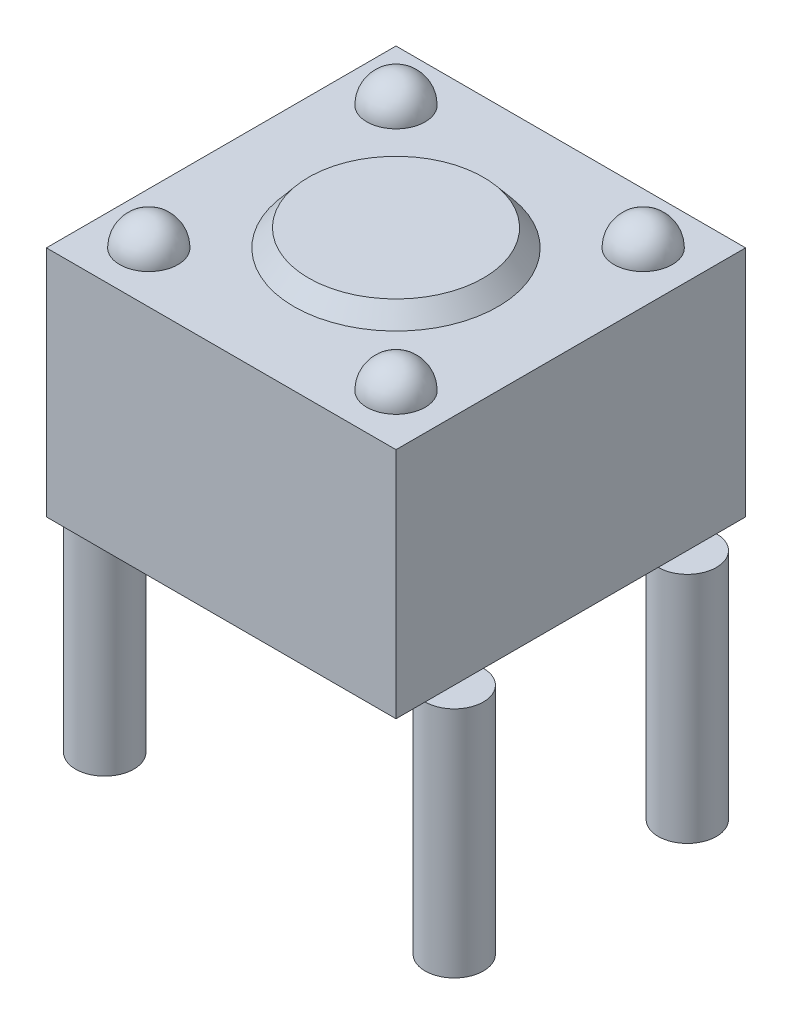
ISO-10303-21;
HEADER;
FILE_DESCRIPTION(('STEP AP214'),'2;1');
FILE_NAME('part.step','',(''),(''),'','','');
FILE_SCHEMA(('AUTOMOTIVE_DESIGN { 1 0 10303 214 1 1 1 1 }'));
ENDSEC;
DATA;
#1=APPLICATION_CONTEXT('core data for automotive mechanical design processes');
#2=APPLICATION_PROTOCOL_DEFINITION('international standard','automotive_design',2000,#1);
#3=PRODUCT_CONTEXT('',#1,'mechanical');
#4=PRODUCT('Part','Part','',(#3));
#5=PRODUCT_RELATED_PRODUCT_CATEGORY('part','',(#4));
#6=PRODUCT_DEFINITION_FORMATION('','',#4);
#7=PRODUCT_DEFINITION_CONTEXT('part definition',#1,'design');
#8=PRODUCT_DEFINITION('design','',#6,#7);
#9=PRODUCT_DEFINITION_SHAPE('','',#8);
#10=(LENGTH_UNIT() NAMED_UNIT(*) SI_UNIT(.MILLI.,.METRE.));
#11=(NAMED_UNIT(*) PLANE_ANGLE_UNIT() SI_UNIT($,.RADIAN.));
#12=(NAMED_UNIT(*) SI_UNIT($,.STERADIAN.) SOLID_ANGLE_UNIT());
#13=UNCERTAINTY_MEASURE_WITH_UNIT(LENGTH_MEASURE(1.E-05),#10,'distance_accuracy_value','');
#14=(GEOMETRIC_REPRESENTATION_CONTEXT(3) GLOBAL_UNCERTAINTY_ASSIGNED_CONTEXT((#13)) GLOBAL_UNIT_ASSIGNED_CONTEXT((#10,
#11,#12)) REPRESENTATION_CONTEXT('',''));
#15=CARTESIAN_POINT('',(0.,0.,0.));
#16=DIRECTION('',(0.,0.,1.));
#17=DIRECTION('',(1.,0.,0.));
#18=AXIS2_PLACEMENT_3D('',#15,#16,#17);
#19=CARTESIAN_POINT('',(-3.,4.,-3.));
#20=DIRECTION('',(1.,0.,0.));
#21=DIRECTION('',(0.,0.,-1.));
#22=AXIS2_PLACEMENT_3D('',#19,#20,#21);
#23=PLANE('',#22);
#24=DIRECTION('',(0.,0.,1.));
#25=VECTOR('',#24,1.);
#26=CARTESIAN_POINT('',(-3.,0.,-3.));
#27=LINE('',#26,#25);
#28=CARTESIAN_POINT('',(-3.,0.,-3.));
#29=VERTEX_POINT('',#28);
#30=CARTESIAN_POINT('',(-3.,0.,-2.5));
#31=VERTEX_POINT('',#30);
#32=EDGE_CURVE('E117',#29,#31,#27,.T.);
#33=ORIENTED_EDGE('',*,*,#32,.T.);
#34=CARTESIAN_POINT('',(-3.,0.,-1.5));
#35=VERTEX_POINT('',#34);
#36=EDGE_CURVE('E121',#31,#35,#27,.T.);
#37=ORIENTED_EDGE('',*,*,#36,.T.);
#38=CARTESIAN_POINT('',(-3.,0.,1.5));
#39=VERTEX_POINT('',#38);
#40=EDGE_CURVE('E120',#35,#39,#27,.T.);
#41=ORIENTED_EDGE('',*,*,#40,.T.);
#42=CARTESIAN_POINT('',(-3.,0.,2.5));
#43=VERTEX_POINT('',#42);
#44=EDGE_CURVE('E104',#39,#43,#27,.T.);
#45=ORIENTED_EDGE('',*,*,#44,.T.);
#46=CARTESIAN_POINT('',(-3.,0.,3.));
#47=VERTEX_POINT('',#46);
#48=EDGE_CURVE('E108',#43,#47,#27,.T.);
#49=ORIENTED_EDGE('',*,*,#48,.T.);
#50=DIRECTION('',(0.,-1.,0.));
#51=VECTOR('',#50,1.);
#52=CARTESIAN_POINT('',(-3.,4.,3.));
#53=LINE('',#52,#51);
#54=CARTESIAN_POINT('',(-3.,4.,3.));
#55=VERTEX_POINT('',#54);
#56=EDGE_CURVE('E143',#55,#47,#53,.T.);
#57=ORIENTED_EDGE('',*,*,#56,.F.);
#58=DIRECTION('',(0.,0.,1.));
#59=VECTOR('',#58,1.);
#60=CARTESIAN_POINT('',(-3.,4.,-3.));
#61=LINE('',#60,#59);
#62=CARTESIAN_POINT('',(-3.,4.,-3.));
#63=VERTEX_POINT('',#62);
#64=EDGE_CURVE('E134',#63,#55,#61,.T.);
#65=ORIENTED_EDGE('',*,*,#64,.F.);
#66=DIRECTION('',(0.,-1.,0.));
#67=VECTOR('',#66,1.);
#68=CARTESIAN_POINT('',(-3.,4.,-3.));
#69=LINE('',#68,#67);
#70=EDGE_CURVE('E135',#63,#29,#69,.T.);
#71=ORIENTED_EDGE('',*,*,#70,.T.);
#72=EDGE_LOOP('',(#33,#37,#41,#45,#49,#57,#65,#71));
#73=FACE_BOUND('',#72,.T.);
#74=ADVANCED_FACE('F34',(#73),#23,.F.);
#75=CARTESIAN_POINT('',(-3.,4.,3.));
#76=DIRECTION('',(0.,0.,-1.));
#77=DIRECTION('',(-1.,0.,0.));
#78=AXIS2_PLACEMENT_3D('',#75,#76,#77);
#79=PLANE('',#78);
#80=DIRECTION('',(1.,0.,0.));
#81=VECTOR('',#80,1.);
#82=CARTESIAN_POINT('',(-3.,0.,3.));
#83=LINE('',#82,#81);
#84=CARTESIAN_POINT('',(3.,0.,3.));
#85=VERTEX_POINT('',#84);
#86=EDGE_CURVE('E111',#47,#85,#83,.T.);
#87=ORIENTED_EDGE('',*,*,#86,.T.);
#88=DIRECTION('',(0.,-1.,0.));
#89=VECTOR('',#88,1.);
#90=CARTESIAN_POINT('',(3.,4.,3.));
#91=LINE('',#90,#89);
#92=CARTESIAN_POINT('',(3.,4.,3.));
#93=VERTEX_POINT('',#92);
#94=EDGE_CURVE('E141',#93,#85,#91,.T.);
#95=ORIENTED_EDGE('',*,*,#94,.F.);
#96=DIRECTION('',(1.,0.,0.));
#97=VECTOR('',#96,1.);
#98=CARTESIAN_POINT('',(-3.,4.,3.));
#99=LINE('',#98,#97);
#100=EDGE_CURVE('E253',#55,#93,#99,.T.);
#101=ORIENTED_EDGE('',*,*,#100,.F.);
#102=ORIENTED_EDGE('',*,*,#56,.T.);
#103=EDGE_LOOP('',(#87,#95,#101,#102));
#104=FACE_BOUND('',#103,.T.);
#105=ADVANCED_FACE('F213',(#104),#79,.F.);
#106=CARTESIAN_POINT('',(3.,4.,-3.));
#107=DIRECTION('',(-1.,0.,0.));
#108=DIRECTION('',(0.,0.,1.));
#109=AXIS2_PLACEMENT_3D('',#106,#107,#108);
#110=PLANE('',#109);
#111=DIRECTION('',(0.,0.,-1.));
#112=VECTOR('',#111,1.);
#113=CARTESIAN_POINT('',(3.,0.,-3.));
#114=LINE('',#113,#112);
#115=CARTESIAN_POINT('',(3.,0.,2.5));
#116=VERTEX_POINT('',#115);
#117=EDGE_CURVE('E128',#85,#116,#114,.T.);
#118=ORIENTED_EDGE('',*,*,#117,.T.);
#119=CARTESIAN_POINT('',(3.,0.,1.5));
#120=VERTEX_POINT('',#119);
#121=EDGE_CURVE('E132',#116,#120,#114,.T.);
#122=ORIENTED_EDGE('',*,*,#121,.T.);
#123=CARTESIAN_POINT('',(3.,0.,-1.5));
#124=VERTEX_POINT('',#123);
#125=EDGE_CURVE('E196',#120,#124,#114,.T.);
#126=ORIENTED_EDGE('',*,*,#125,.T.);
#127=CARTESIAN_POINT('',(3.,0.,-2.5));
#128=VERTEX_POINT('',#127);
#129=EDGE_CURVE('E195',#124,#128,#114,.T.);
#130=ORIENTED_EDGE('',*,*,#129,.T.);
#131=CARTESIAN_POINT('',(3.,0.,-3.));
#132=VERTEX_POINT('',#131);
#133=EDGE_CURVE('E127',#128,#132,#114,.T.);
#134=ORIENTED_EDGE('',*,*,#133,.T.);
#135=DIRECTION('',(0.,-1.,0.));
#136=VECTOR('',#135,1.);
#137=CARTESIAN_POINT('',(3.,4.,-3.));
#138=LINE('',#137,#136);
#139=CARTESIAN_POINT('',(3.,4.,-3.));
#140=VERTEX_POINT('',#139);
#141=EDGE_CURVE('E138',#140,#132,#138,.T.);
#142=ORIENTED_EDGE('',*,*,#141,.F.);
#143=DIRECTION('',(0.,0.,-1.));
#144=VECTOR('',#143,1.);
#145=CARTESIAN_POINT('',(3.,4.,-3.));
#146=LINE('',#145,#144);
#147=EDGE_CURVE('E192',#93,#140,#146,.T.);
#148=ORIENTED_EDGE('',*,*,#147,.F.);
#149=ORIENTED_EDGE('',*,*,#94,.T.);
#150=EDGE_LOOP('',(#118,#122,#126,#130,#134,#142,#148,#149));
#151=FACE_BOUND('',#150,.T.);
#152=ADVANCED_FACE('F191',(#151),#110,.F.);
#153=CARTESIAN_POINT('',(-3.,4.,-3.));
#154=DIRECTION('',(0.,0.,1.));
#155=DIRECTION('',(1.,0.,0.));
#156=AXIS2_PLACEMENT_3D('',#153,#154,#155);
#157=PLANE('',#156);
#158=DIRECTION('',(-1.,0.,0.));
#159=VECTOR('',#158,1.);
#160=CARTESIAN_POINT('',(-3.,0.,-3.));
#161=LINE('',#160,#159);
#162=EDGE_CURVE('E131',#132,#29,#161,.T.);
#163=ORIENTED_EDGE('',*,*,#162,.T.);
#164=ORIENTED_EDGE('',*,*,#70,.F.);
#165=DIRECTION('',(-1.,0.,0.));
#166=VECTOR('',#165,1.);
#167=CARTESIAN_POINT('',(-3.,4.,-3.));
#168=LINE('',#167,#166);
#169=EDGE_CURVE('E124',#140,#63,#168,.T.);
#170=ORIENTED_EDGE('',*,*,#169,.F.);
#171=ORIENTED_EDGE('',*,*,#141,.T.);
#172=EDGE_LOOP('',(#163,#164,#170,#171));
#173=FACE_BOUND('',#172,.T.);
#174=ADVANCED_FACE('F186',(#173),#157,.F.);
#175=CARTESIAN_POINT('',(0.,4.,0.));
#176=DIRECTION('',(0.,1.,0.));
#177=DIRECTION('',(0.,0.,1.));
#178=AXIS2_PLACEMENT_3D('',#175,#176,#177);
#179=PLANE('',#178);
#180=CARTESIAN_POINT('',(-2.12132034355951,4.,2.12132034355965));
#181=DIRECTION('',(0.,1.,0.));
#182=DIRECTION('',(0.,0.,1.));
#183=AXIS2_PLACEMENT_3D('',#180,#181,#182);
#184=CIRCLE('',#183,0.500000000000063);
#185=CARTESIAN_POINT('',(-2.12132034355951,4.,2.62132034355972));
#186=VERTEX_POINT('',#185);
#187=EDGE_CURVE('E157',#186,#186,#184,.T.);
#188=ORIENTED_EDGE('',*,*,#187,.F.);
#189=EDGE_LOOP('',(#188));
#190=FACE_BOUND('',#189,.T.);
#191=CARTESIAN_POINT('',(2.12132034355977,4.,2.12132034355951));
#192=DIRECTION('',(0.,1.,0.));
#193=DIRECTION('',(0.,0.,1.));
#194=AXIS2_PLACEMENT_3D('',#191,#192,#193);
#195=CIRCLE('',#194,0.500000000000167);
#196=CARTESIAN_POINT('',(2.12132034355977,4.,2.62132034355968));
#197=VERTEX_POINT('',#196);
#198=EDGE_CURVE('E236',#197,#197,#195,.T.);
#199=ORIENTED_EDGE('',*,*,#198,.F.);
#200=EDGE_LOOP('',(#199));
#201=FACE_BOUND('',#200,.T.);
#202=CARTESIAN_POINT('',(2.12132034355963,4.,-2.12132034355977));
#203=DIRECTION('',(0.,1.,0.));
#204=DIRECTION('',(0.,0.,1.));
#205=AXIS2_PLACEMENT_3D('',#202,#203,#204);
#206=CIRCLE('',#205,0.500000000000123);
#207=CARTESIAN_POINT('',(2.12132034355963,4.,-1.62132034355965));
#208=VERTEX_POINT('',#207);
#209=EDGE_CURVE('E238',#208,#208,#206,.T.);
#210=ORIENTED_EDGE('',*,*,#209,.F.);
#211=EDGE_LOOP('',(#210));
#212=FACE_BOUND('',#211,.T.);
#213=CARTESIAN_POINT('',(-2.12132034355965,4.,-2.12132034355963));
#214=DIRECTION('',(0.,1.,0.));
#215=DIRECTION('',(0.,0.,1.));
#216=AXIS2_PLACEMENT_3D('',#213,#214,#215);
#217=CIRCLE('',#216,0.5);
#218=CARTESIAN_POINT('',(-2.12132034355965,4.,-1.62132034355963));
#219=VERTEX_POINT('',#218);
#220=EDGE_CURVE('E243',#219,#219,#217,.T.);
#221=ORIENTED_EDGE('',*,*,#220,.F.);
#222=EDGE_LOOP('',(#221));
#223=FACE_BOUND('',#222,.T.);
#224=CARTESIAN_POINT('',(0.,4.,0.));
#225=DIRECTION('',(0.,1.,0.));
#226=DIRECTION('',(0.,0.,1.));
#227=AXIS2_PLACEMENT_3D('',#224,#225,#226);
#228=CIRCLE('',#227,1.75);
#229=CARTESIAN_POINT('',(0.,4.,1.75));
#230=VERTEX_POINT('',#229);
#231=EDGE_CURVE('E115',#230,#230,#228,.T.);
#232=ORIENTED_EDGE('',*,*,#231,.F.);
#233=EDGE_LOOP('',(#232));
#234=FACE_BOUND('',#233,.T.);
#235=ORIENTED_EDGE('',*,*,#64,.T.);
#236=ORIENTED_EDGE('',*,*,#100,.T.);
#237=ORIENTED_EDGE('',*,*,#147,.T.);
#238=ORIENTED_EDGE('',*,*,#169,.T.);
#239=EDGE_LOOP('',(#235,#236,#237,#238));
#240=FACE_BOUND('',#239,.T.);
#241=ADVANCED_FACE('F255',(#190,#201,#212,#223,#234,#240),#179,.T.);
#242=CARTESIAN_POINT('',(0.,0.,0.));
#243=DIRECTION('',(0.,1.,0.));
#244=DIRECTION('',(0.,0.,1.));
#245=AXIS2_PLACEMENT_3D('',#242,#243,#244);
#246=PLANE('',#245);
#247=ORIENTED_EDGE('',*,*,#48,.F.);
#248=CARTESIAN_POINT('',(-3.,0.,2.));
#249=DIRECTION('',(0.,1.,0.));
#250=DIRECTION('',(0.,0.,1.));
#251=AXIS2_PLACEMENT_3D('',#248,#249,#250);
#252=CIRCLE('',#251,0.5);
#253=EDGE_CURVE('E11',#43,#39,#252,.T.);
#254=ORIENTED_EDGE('',*,*,#253,.T.);
#255=ORIENTED_EDGE('',*,*,#40,.F.);
#256=CARTESIAN_POINT('',(-3.,0.,-2.));
#257=DIRECTION('',(0.,1.,0.));
#258=DIRECTION('',(0.,0.,1.));
#259=AXIS2_PLACEMENT_3D('',#256,#257,#258);
#260=CIRCLE('',#259,0.5);
#261=EDGE_CURVE('E167',#35,#31,#260,.T.);
#262=ORIENTED_EDGE('',*,*,#261,.T.);
#263=ORIENTED_EDGE('',*,*,#32,.F.);
#264=ORIENTED_EDGE('',*,*,#162,.F.);
#265=ORIENTED_EDGE('',*,*,#133,.F.);
#266=CARTESIAN_POINT('',(3.,0.,-2.));
#267=DIRECTION('',(0.,1.,0.));
#268=DIRECTION('',(0.,0.,-1.));
#269=AXIS2_PLACEMENT_3D('',#266,#267,#268);
#270=CIRCLE('',#269,0.5);
#271=EDGE_CURVE('E159',#128,#124,#270,.T.);
#272=ORIENTED_EDGE('',*,*,#271,.T.);
#273=ORIENTED_EDGE('',*,*,#125,.F.);
#274=CARTESIAN_POINT('',(3.,0.,2.));
#275=DIRECTION('',(0.,1.,0.));
#276=DIRECTION('',(0.,0.,1.));
#277=AXIS2_PLACEMENT_3D('',#274,#275,#276);
#278=CIRCLE('',#277,0.5);
#279=EDGE_CURVE('E42',#120,#116,#278,.T.);
#280=ORIENTED_EDGE('',*,*,#279,.T.);
#281=ORIENTED_EDGE('',*,*,#117,.F.);
#282=ORIENTED_EDGE('',*,*,#86,.F.);
#283=EDGE_LOOP('',(#247,#254,#255,#262,#263,#264,#265,#272,#273,#280,#281,#282));
#284=FACE_BOUND('',#283,.T.);
#285=ADVANCED_FACE('F109',(#284),#246,.F.);
#286=CARTESIAN_POINT('',(0.,4.,0.));
#287=DIRECTION('',(0.,-1.,0.));
#288=DIRECTION('',(0.,0.,-1.));
#289=AXIS2_PLACEMENT_3D('',#286,#287,#288);
#290=CONICAL_SURFACE('',#289,1.75,0.694738276196703);
#291=CARTESIAN_POINT('',(0.,4.3,0.));
#292=DIRECTION('',(0.,1.,0.));
#293=DIRECTION('',(0.,0.,1.));
#294=AXIS2_PLACEMENT_3D('',#291,#292,#293);
#295=CIRCLE('',#294,1.5);
#296=CARTESIAN_POINT('',(0.,4.3,1.5));
#297=VERTEX_POINT('',#296);
#298=EDGE_CURVE('E246',#297,#297,#295,.T.);
#299=ORIENTED_EDGE('',*,*,#298,.F.);
#300=EDGE_LOOP('',(#299));
#301=FACE_BOUND('',#300,.T.);
#302=ORIENTED_EDGE('',*,*,#231,.T.);
#303=EDGE_LOOP('',(#302));
#304=FACE_BOUND('',#303,.T.);
#305=ADVANCED_FACE('F263',(#301,#304),#290,.T.);
#306=CARTESIAN_POINT('',(0.,4.3,0.));
#307=DIRECTION('',(0.,1.,0.));
#308=DIRECTION('',(0.,0.,1.));
#309=AXIS2_PLACEMENT_3D('',#306,#307,#308);
#310=PLANE('',#309);
#311=ORIENTED_EDGE('',*,*,#298,.T.);
#312=EDGE_LOOP('',(#311));
#313=FACE_BOUND('',#312,.T.);
#314=ADVANCED_FACE('F225',(#313),#310,.T.);
#315=CARTESIAN_POINT('',(2.12132034355963,4.,-2.12132034355977));
#316=DIRECTION('',(0.,1.,0.));
#317=DIRECTION('',(0.,0.,1.));
#318=AXIS2_PLACEMENT_3D('',#315,#316,#317);
#319=SPHERICAL_SURFACE('',#318,0.5);
#320=ORIENTED_EDGE('',*,*,#209,.T.);
#321=EDGE_LOOP('',(#320));
#322=FACE_BOUND('',#321,.T.);
#323=ADVANCED_FACE('F221',(#322),#319,.T.);
#324=CARTESIAN_POINT('',(2.12132034355977,4.,2.12132034355951));
#325=DIRECTION('',(0.,1.,0.));
#326=DIRECTION('',(0.,0.,1.));
#327=AXIS2_PLACEMENT_3D('',#324,#325,#326);
#328=SPHERICAL_SURFACE('',#327,0.5);
#329=ORIENTED_EDGE('',*,*,#198,.T.);
#330=EDGE_LOOP('',(#329));
#331=FACE_BOUND('',#330,.T.);
#332=ADVANCED_FACE('F224',(#331),#328,.T.);
#333=CARTESIAN_POINT('',(-2.12132034355951,4.,2.12132034355965));
#334=DIRECTION('',(0.,1.,0.));
#335=DIRECTION('',(0.,0.,1.));
#336=AXIS2_PLACEMENT_3D('',#333,#334,#335);
#337=SPHERICAL_SURFACE('',#336,0.5);
#338=ORIENTED_EDGE('',*,*,#187,.T.);
#339=EDGE_LOOP('',(#338));
#340=FACE_BOUND('',#339,.T.);
#341=ADVANCED_FACE('F209',(#340),#337,.T.);
#342=CARTESIAN_POINT('',(-2.12132034355965,4.,-2.12132034355963));
#343=DIRECTION('',(0.,1.,0.));
#344=DIRECTION('',(0.,0.,1.));
#345=AXIS2_PLACEMENT_3D('',#342,#343,#344);
#346=SPHERICAL_SURFACE('',#345,0.5);
#347=ORIENTED_EDGE('',*,*,#220,.T.);
#348=EDGE_LOOP('',(#347));
#349=FACE_BOUND('',#348,.T.);
#350=ADVANCED_FACE('F36',(#349),#346,.T.);
#351=CARTESIAN_POINT('',(3.,0.,2.));
#352=DIRECTION('',(0.,1.,0.));
#353=DIRECTION('',(0.,0.,1.));
#354=AXIS2_PLACEMENT_3D('',#351,#352,#353);
#355=PLANE('',#354);
#356=ORIENTED_EDGE('',*,*,#121,.F.);
#357=EDGE_CURVE('E147',#116,#120,#278,.T.);
#358=ORIENTED_EDGE('',*,*,#357,.T.);
#359=EDGE_LOOP('',(#356,#358));
#360=FACE_BOUND('',#359,.T.);
#361=ADVANCED_FACE('F198',(#360),#355,.T.);
#362=CARTESIAN_POINT('',(3.,-4.,2.));
#363=DIRECTION('',(0.,1.,0.));
#364=DIRECTION('',(0.,0.,1.));
#365=AXIS2_PLACEMENT_3D('',#362,#363,#364);
#366=CYLINDRICAL_SURFACE('',#365,0.5);
#367=CARTESIAN_POINT('',(3.,-4.,2.));
#368=DIRECTION('',(0.,1.,0.));
#369=DIRECTION('',(0.,0.,1.));
#370=AXIS2_PLACEMENT_3D('',#367,#368,#369);
#371=CIRCLE('',#370,0.5);
#372=CARTESIAN_POINT('',(3.,-4.,2.5));
#373=VERTEX_POINT('',#372);
#374=EDGE_CURVE('E152',#373,#373,#371,.T.);
#375=ORIENTED_EDGE('',*,*,#374,.T.);
#376=EDGE_LOOP('',(#375));
#377=FACE_BOUND('',#376,.T.);
#378=ORIENTED_EDGE('',*,*,#357,.F.);
#379=ORIENTED_EDGE('',*,*,#279,.F.);
#380=EDGE_LOOP('',(#378,#379));
#381=FACE_BOUND('',#380,.T.);
#382=ADVANCED_FACE('F200',(#377,#381),#366,.T.);
#383=CARTESIAN_POINT('',(3.,-4.,2.));
#384=DIRECTION('',(0.,1.,0.));
#385=DIRECTION('',(0.,0.,1.));
#386=AXIS2_PLACEMENT_3D('',#383,#384,#385);
#387=PLANE('',#386);
#388=ORIENTED_EDGE('',*,*,#374,.F.);
#389=EDGE_LOOP('',(#388));
#390=FACE_BOUND('',#389,.T.);
#391=ADVANCED_FACE('F206',(#390),#387,.F.);
#392=CARTESIAN_POINT('',(3.,0.,-2.));
#393=DIRECTION('',(0.,-1.,0.));
#394=DIRECTION('',(0.,0.,-1.));
#395=AXIS2_PLACEMENT_3D('',#392,#393,#394);
#396=PLANE('',#395);
#397=EDGE_CURVE('E164',#124,#128,#270,.T.);
#398=ORIENTED_EDGE('',*,*,#397,.T.);
#399=ORIENTED_EDGE('',*,*,#129,.F.);
#400=EDGE_LOOP('',(#398,#399));
#401=FACE_BOUND('',#400,.T.);
#402=ADVANCED_FACE('F353',(#401),#396,.F.);
#403=CARTESIAN_POINT('',(3.,-4.,-2.));
#404=DIRECTION('',(0.,1.,0.));
#405=DIRECTION('',(0.,0.,1.));
#406=AXIS2_PLACEMENT_3D('',#403,#404,#405);
#407=CYLINDRICAL_SURFACE('',#406,0.5);
#408=CARTESIAN_POINT('',(3.,-4.,-2.));
#409=DIRECTION('',(0.,1.,0.));
#410=DIRECTION('',(0.,0.,-1.));
#411=AXIS2_PLACEMENT_3D('',#408,#409,#410);
#412=CIRCLE('',#411,0.5);
#413=CARTESIAN_POINT('',(3.,-4.,-2.5));
#414=VERTEX_POINT('',#413);
#415=EDGE_CURVE('E153',#414,#414,#412,.T.);
#416=ORIENTED_EDGE('',*,*,#415,.T.);
#417=EDGE_LOOP('',(#416));
#418=FACE_BOUND('',#417,.T.);
#419=ORIENTED_EDGE('',*,*,#271,.F.);
#420=ORIENTED_EDGE('',*,*,#397,.F.);
#421=EDGE_LOOP('',(#419,#420));
#422=FACE_BOUND('',#421,.T.);
#423=ADVANCED_FACE('F361',(#418,#422),#407,.T.);
#424=CARTESIAN_POINT('',(3.,-4.,-2.));
#425=DIRECTION('',(0.,-1.,0.));
#426=DIRECTION('',(0.,0.,-1.));
#427=AXIS2_PLACEMENT_3D('',#424,#425,#426);
#428=PLANE('',#427);
#429=ORIENTED_EDGE('',*,*,#415,.F.);
#430=EDGE_LOOP('',(#429));
#431=FACE_BOUND('',#430,.T.);
#432=ADVANCED_FACE('F370',(#431),#428,.T.);
#433=CARTESIAN_POINT('',(-3.,0.,-2.));
#434=DIRECTION('',(0.,1.,0.));
#435=DIRECTION('',(0.,0.,1.));
#436=AXIS2_PLACEMENT_3D('',#433,#434,#435);
#437=PLANE('',#436);
#438=ORIENTED_EDGE('',*,*,#36,.F.);
#439=EDGE_CURVE('E55',#31,#35,#260,.T.);
#440=ORIENTED_EDGE('',*,*,#439,.T.);
#441=EDGE_LOOP('',(#438,#440));
#442=FACE_BOUND('',#441,.T.);
#443=ADVANCED_FACE('F177',(#442),#437,.T.);
#444=CARTESIAN_POINT('',(-3.,-4.,-2.));
#445=DIRECTION('',(0.,1.,0.));
#446=DIRECTION('',(0.,0.,1.));
#447=AXIS2_PLACEMENT_3D('',#444,#445,#446);
#448=CYLINDRICAL_SURFACE('',#447,0.5);
#449=CARTESIAN_POINT('',(-3.,-4.,-2.));
#450=DIRECTION('',(0.,1.,0.));
#451=DIRECTION('',(0.,0.,1.));
#452=AXIS2_PLACEMENT_3D('',#449,#450,#451);
#453=CIRCLE('',#452,0.5);
#454=CARTESIAN_POINT('',(-3.,-4.,-1.5));
#455=VERTEX_POINT('',#454);
#456=EDGE_CURVE('E170',#455,#455,#453,.T.);
#457=ORIENTED_EDGE('',*,*,#456,.T.);
#458=EDGE_LOOP('',(#457));
#459=FACE_BOUND('',#458,.T.);
#460=ORIENTED_EDGE('',*,*,#261,.F.);
#461=ORIENTED_EDGE('',*,*,#439,.F.);
#462=EDGE_LOOP('',(#460,#461));
#463=FACE_BOUND('',#462,.T.);
#464=ADVANCED_FACE('F178',(#459,#463),#448,.T.);
#465=CARTESIAN_POINT('',(-3.,-4.,-2.));
#466=DIRECTION('',(0.,1.,0.));
#467=DIRECTION('',(0.,0.,1.));
#468=AXIS2_PLACEMENT_3D('',#465,#466,#467);
#469=PLANE('',#468);
#470=ORIENTED_EDGE('',*,*,#456,.F.);
#471=EDGE_LOOP('',(#470));
#472=FACE_BOUND('',#471,.T.);
#473=ADVANCED_FACE('F393',(#472),#469,.F.);
#474=CARTESIAN_POINT('',(-3.,0.,2.));
#475=DIRECTION('',(0.,-1.,0.));
#476=DIRECTION('',(0.,0.,-1.));
#477=AXIS2_PLACEMENT_3D('',#474,#475,#476);
#478=PLANE('',#477);
#479=CARTESIAN_POINT('',(-3.,0.,2.));
#480=DIRECTION('',(0.,1.,0.));
#481=DIRECTION('',(0.,0.,-1.));
#482=AXIS2_PLACEMENT_3D('',#479,#480,#481);
#483=CIRCLE('',#482,0.5);
#484=EDGE_CURVE('E48',#39,#43,#483,.T.);
#485=ORIENTED_EDGE('',*,*,#484,.T.);
#486=ORIENTED_EDGE('',*,*,#44,.F.);
#487=EDGE_LOOP('',(#485,#486));
#488=FACE_BOUND('',#487,.T.);
#489=ADVANCED_FACE('F102',(#488),#478,.F.);
#490=CARTESIAN_POINT('',(-3.,-4.,2.));
#491=DIRECTION('',(0.,1.,0.));
#492=DIRECTION('',(0.,0.,1.));
#493=AXIS2_PLACEMENT_3D('',#490,#491,#492);
#494=CYLINDRICAL_SURFACE('',#493,0.5);
#495=CARTESIAN_POINT('',(-3.,-4.,2.));
#496=DIRECTION('',(0.,1.,0.));
#497=DIRECTION('',(0.,0.,-1.));
#498=AXIS2_PLACEMENT_3D('',#495,#496,#497);
#499=CIRCLE('',#498,0.5);
#500=CARTESIAN_POINT('',(-3.,-4.,1.5));
#501=VERTEX_POINT('',#500);
#502=EDGE_CURVE('E105',#501,#501,#499,.T.);
#503=ORIENTED_EDGE('',*,*,#502,.T.);
#504=EDGE_LOOP('',(#503));
#505=FACE_BOUND('',#504,.T.);
#506=ORIENTED_EDGE('',*,*,#484,.F.);
#507=ORIENTED_EDGE('',*,*,#253,.F.);
#508=EDGE_LOOP('',(#506,#507));
#509=FACE_BOUND('',#508,.T.);
#510=ADVANCED_FACE('F96',(#505,#509),#494,.T.);
#511=CARTESIAN_POINT('',(-3.,-4.,2.));
#512=DIRECTION('',(0.,-1.,0.));
#513=DIRECTION('',(0.,0.,-1.));
#514=AXIS2_PLACEMENT_3D('',#511,#512,#513);
#515=PLANE('',#514);
#516=ORIENTED_EDGE('',*,*,#502,.F.);
#517=EDGE_LOOP('',(#516));
#518=FACE_BOUND('',#517,.T.);
#519=ADVANCED_FACE('F417',(#518),#515,.T.);
#520=CLOSED_SHELL('',(#74,#105,#152,#174,#241,#285,#305,#314,#323,#332,#341,#350,#361,#382,#391,
#402,#423,#432,#443,#464,#473,#489,#510,#519));
#521=MANIFOLD_SOLID_BREP('B2',#520);
#522=ADVANCED_BREP_SHAPE_REPRESENTATION('',(#18,#521),#14);
#523=SHAPE_DEFINITION_REPRESENTATION(#9,#522);
ENDSEC;
END-ISO-10303-21;
